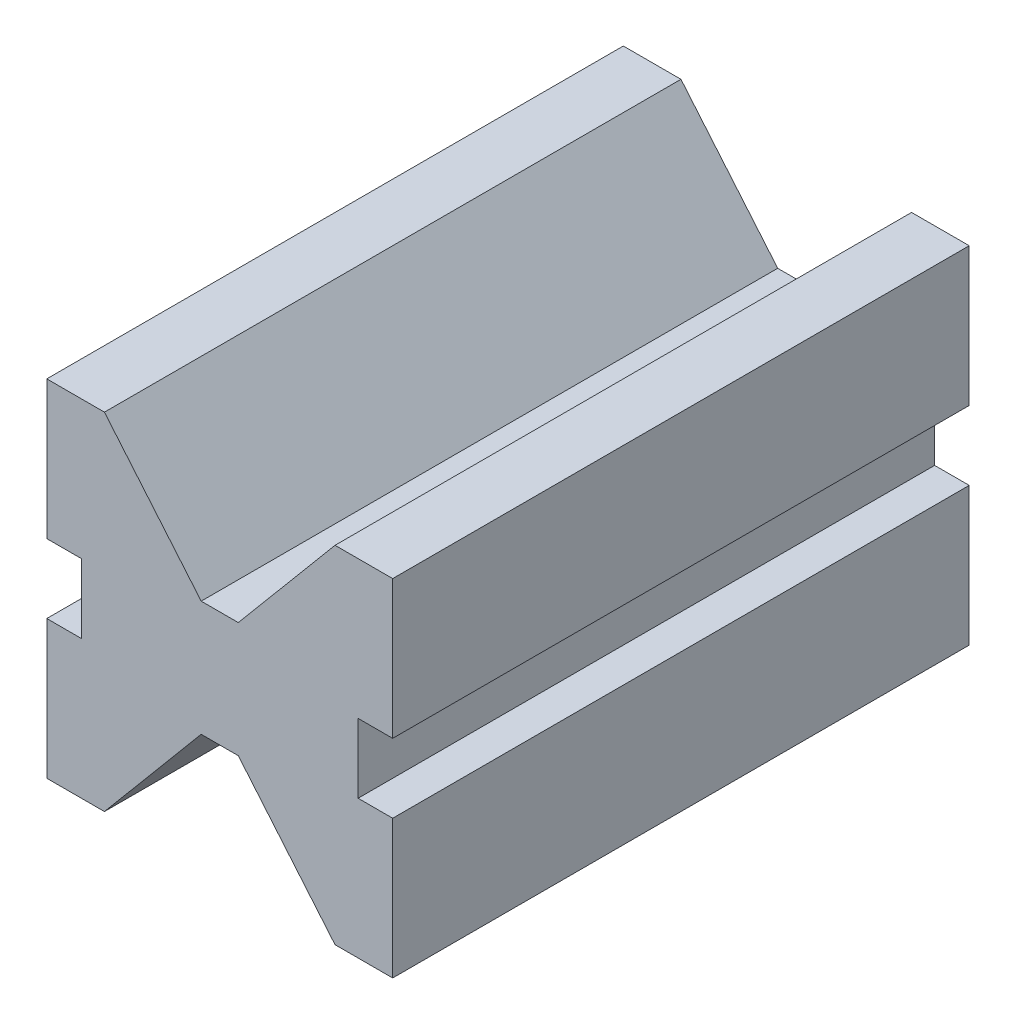
ISO-10303-21;
HEADER;
FILE_DESCRIPTION(('STEP AP214'),'2;1');
FILE_NAME('part.step','',(''),(''),'','','');
FILE_SCHEMA(('AUTOMOTIVE_DESIGN { 1 0 10303 214 1 1 1 1 }'));
ENDSEC;
DATA;
#1=APPLICATION_CONTEXT('core data for automotive mechanical design processes');
#2=APPLICATION_PROTOCOL_DEFINITION('international standard','automotive_design',2000,#1);
#3=PRODUCT_CONTEXT('',#1,'mechanical');
#4=PRODUCT('Part','Part','',(#3));
#5=PRODUCT_RELATED_PRODUCT_CATEGORY('part','',(#4));
#6=PRODUCT_DEFINITION_FORMATION('','',#4);
#7=PRODUCT_DEFINITION_CONTEXT('part definition',#1,'design');
#8=PRODUCT_DEFINITION('design','',#6,#7);
#9=PRODUCT_DEFINITION_SHAPE('','',#8);
#10=(LENGTH_UNIT() NAMED_UNIT(*) SI_UNIT(.MILLI.,.METRE.));
#11=(NAMED_UNIT(*) PLANE_ANGLE_UNIT() SI_UNIT($,.RADIAN.));
#12=(NAMED_UNIT(*) SI_UNIT($,.STERADIAN.) SOLID_ANGLE_UNIT());
#13=UNCERTAINTY_MEASURE_WITH_UNIT(LENGTH_MEASURE(1.E-05),#10,'distance_accuracy_value','');
#14=(GEOMETRIC_REPRESENTATION_CONTEXT(3) GLOBAL_UNCERTAINTY_ASSIGNED_CONTEXT((#13)) GLOBAL_UNIT_ASSIGNED_CONTEXT((#10,
#11,#12)) REPRESENTATION_CONTEXT('',''));
#15=CARTESIAN_POINT('',(0.,0.,0.));
#16=DIRECTION('',(0.,0.,1.));
#17=DIRECTION('',(1.,0.,0.));
#18=AXIS2_PLACEMENT_3D('',#15,#16,#17);
#19=CARTESIAN_POINT('',(-20.,0.,-100.));
#20=DIRECTION('',(0.766044443118979,-0.642787609686538,0.));
#21=DIRECTION('',(0.642787609686538,0.766044443118979,0.));
#22=AXIS2_PLACEMENT_3D('',#19,#20,#21);
#23=PLANE('',#22);
#24=DIRECTION('',(0.642787609686538,0.766044443118979,0.));
#25=VECTOR('',#24,1.);
#26=CARTESIAN_POINT('',(-20.,0.,0.));
#27=LINE('',#26,#25);
#28=CARTESIAN_POINT('',(-20.,0.,0.));
#29=VERTEX_POINT('',#28);
#30=CARTESIAN_POINT('',(-3.21800737645446,20.,0.));
#31=VERTEX_POINT('',#30);
#32=EDGE_CURVE('E220',#29,#31,#27,.T.);
#33=ORIENTED_EDGE('',*,*,#32,.F.);
#34=DIRECTION('',(0.,0.,1.));
#35=VECTOR('',#34,1.);
#36=CARTESIAN_POINT('',(-20.,0.,-100.));
#37=LINE('',#36,#35);
#38=CARTESIAN_POINT('',(-20.,0.,-100.));
#39=VERTEX_POINT('',#38);
#40=EDGE_CURVE('E11',#39,#29,#37,.T.);
#41=ORIENTED_EDGE('',*,*,#40,.F.);
#42=DIRECTION('',(0.642787609686538,0.766044443118979,0.));
#43=VECTOR('',#42,1.);
#44=CARTESIAN_POINT('',(-20.,0.,-100.));
#45=LINE('',#44,#43);
#46=CARTESIAN_POINT('',(-3.21800737645446,20.,-100.));
#47=VERTEX_POINT('',#46);
#48=EDGE_CURVE('E296',#39,#47,#45,.T.);
#49=ORIENTED_EDGE('',*,*,#48,.T.);
#50=DIRECTION('',(0.,0.,1.));
#51=VECTOR('',#50,1.);
#52=CARTESIAN_POINT('',(-3.21800737645446,20.,-100.));
#53=LINE('',#52,#51);
#54=EDGE_CURVE('E48',#47,#31,#53,.T.);
#55=ORIENTED_EDGE('',*,*,#54,.T.);
#56=EDGE_LOOP('',(#33,#41,#49,#55));
#57=FACE_BOUND('',#56,.T.);
#58=ADVANCED_FACE('F45',(#57),#23,.T.);
#59=CARTESIAN_POINT('',(-20.,0.,-100.));
#60=DIRECTION('',(0.,-1.,0.));
#61=DIRECTION('',(1.,0.,0.));
#62=AXIS2_PLACEMENT_3D('',#59,#60,#61);
#63=PLANE('',#62);
#64=DIRECTION('',(1.,0.,0.));
#65=VECTOR('',#64,1.);
#66=CARTESIAN_POINT('',(-20.,0.,0.));
#67=LINE('',#66,#65);
#68=CARTESIAN_POINT('',(-30.,0.,0.));
#69=VERTEX_POINT('',#68);
#70=EDGE_CURVE('E293',#69,#29,#67,.T.);
#71=ORIENTED_EDGE('',*,*,#70,.F.);
#72=DIRECTION('',(0.,0.,1.));
#73=VECTOR('',#72,1.);
#74=CARTESIAN_POINT('',(-30.,0.,-100.));
#75=LINE('',#74,#73);
#76=CARTESIAN_POINT('',(-30.,0.,-100.));
#77=VERTEX_POINT('',#76);
#78=EDGE_CURVE('E55',#77,#69,#75,.T.);
#79=ORIENTED_EDGE('',*,*,#78,.F.);
#80=DIRECTION('',(1.,0.,0.));
#81=VECTOR('',#80,1.);
#82=CARTESIAN_POINT('',(-20.,0.,-100.));
#83=LINE('',#82,#81);
#84=EDGE_CURVE('E206',#77,#39,#83,.T.);
#85=ORIENTED_EDGE('',*,*,#84,.T.);
#86=ORIENTED_EDGE('',*,*,#40,.T.);
#87=EDGE_LOOP('',(#71,#79,#85,#86));
#88=FACE_BOUND('',#87,.T.);
#89=ADVANCED_FACE('F350',(#88),#63,.T.);
#90=CARTESIAN_POINT('',(-30.,0.,-100.));
#91=DIRECTION('',(-1.,0.,0.));
#92=DIRECTION('',(0.,0.,1.));
#93=AXIS2_PLACEMENT_3D('',#90,#91,#92);
#94=PLANE('',#93);
#95=DIRECTION('',(0.,-1.,0.));
#96=VECTOR('',#95,1.);
#97=CARTESIAN_POINT('',(-30.,0.,0.));
#98=LINE('',#97,#96);
#99=CARTESIAN_POINT('',(-30.,24.,0.));
#100=VERTEX_POINT('',#99);
#101=EDGE_CURVE('E192',#100,#69,#98,.T.);
#102=ORIENTED_EDGE('',*,*,#101,.F.);
#103=DIRECTION('',(0.,0.,1.));
#104=VECTOR('',#103,1.);
#105=CARTESIAN_POINT('',(-30.,24.,-100.));
#106=LINE('',#105,#104);
#107=CARTESIAN_POINT('',(-30.,24.,-100.));
#108=VERTEX_POINT('',#107);
#109=EDGE_CURVE('E187',#108,#100,#106,.T.);
#110=ORIENTED_EDGE('',*,*,#109,.F.);
#111=DIRECTION('',(0.,-1.,0.));
#112=VECTOR('',#111,1.);
#113=CARTESIAN_POINT('',(-30.,0.,-100.));
#114=LINE('',#113,#112);
#115=EDGE_CURVE('E190',#108,#77,#114,.T.);
#116=ORIENTED_EDGE('',*,*,#115,.T.);
#117=ORIENTED_EDGE('',*,*,#78,.T.);
#118=EDGE_LOOP('',(#102,#110,#116,#117));
#119=FACE_BOUND('',#118,.T.);
#120=ADVANCED_FACE('F189',(#119),#94,.T.);
#121=CARTESIAN_POINT('',(-30.,24.,-100.));
#122=DIRECTION('',(0.,1.,0.));
#123=DIRECTION('',(0.,0.,1.));
#124=AXIS2_PLACEMENT_3D('',#121,#122,#123);
#125=PLANE('',#124);
#126=DIRECTION('',(-1.,0.,0.));
#127=VECTOR('',#126,1.);
#128=CARTESIAN_POINT('',(-30.,24.,0.));
#129=LINE('',#128,#127);
#130=CARTESIAN_POINT('',(-24.,24.,0.));
#131=VERTEX_POINT('',#130);
#132=EDGE_CURVE('E288',#131,#100,#129,.T.);
#133=ORIENTED_EDGE('',*,*,#132,.F.);
#134=DIRECTION('',(0.,0.,1.));
#135=VECTOR('',#134,1.);
#136=CARTESIAN_POINT('',(-24.,24.,-100.));
#137=LINE('',#136,#135);
#138=CARTESIAN_POINT('',(-24.,24.,-100.));
#139=VERTEX_POINT('',#138);
#140=EDGE_CURVE('E198',#139,#131,#137,.T.);
#141=ORIENTED_EDGE('',*,*,#140,.F.);
#142=DIRECTION('',(-1.,0.,0.));
#143=VECTOR('',#142,1.);
#144=CARTESIAN_POINT('',(-30.,24.,-100.));
#145=LINE('',#144,#143);
#146=EDGE_CURVE('E204',#139,#108,#145,.T.);
#147=ORIENTED_EDGE('',*,*,#146,.T.);
#148=ORIENTED_EDGE('',*,*,#109,.T.);
#149=EDGE_LOOP('',(#133,#141,#147,#148));
#150=FACE_BOUND('',#149,.T.);
#151=ADVANCED_FACE('F209',(#150),#125,.T.);
#152=CARTESIAN_POINT('',(-24.,24.,-100.));
#153=DIRECTION('',(-1.,0.,0.));
#154=DIRECTION('',(0.,0.,1.));
#155=AXIS2_PLACEMENT_3D('',#152,#153,#154);
#156=PLANE('',#155);
#157=DIRECTION('',(0.,-1.,0.));
#158=VECTOR('',#157,1.);
#159=CARTESIAN_POINT('',(-24.,24.,0.));
#160=LINE('',#159,#158);
#161=CARTESIAN_POINT('',(-24.,36.,0.));
#162=VERTEX_POINT('',#161);
#163=EDGE_CURVE('E284',#162,#131,#160,.T.);
#164=ORIENTED_EDGE('',*,*,#163,.F.);
#165=DIRECTION('',(0.,0.,1.));
#166=VECTOR('',#165,1.);
#167=CARTESIAN_POINT('',(-24.,36.,-100.));
#168=LINE('',#167,#166);
#169=CARTESIAN_POINT('',(-24.,36.,-100.));
#170=VERTEX_POINT('',#169);
#171=EDGE_CURVE('E302',#170,#162,#168,.T.);
#172=ORIENTED_EDGE('',*,*,#171,.F.);
#173=DIRECTION('',(0.,-1.,0.));
#174=VECTOR('',#173,1.);
#175=CARTESIAN_POINT('',(-24.,24.,-100.));
#176=LINE('',#175,#174);
#177=EDGE_CURVE('E211',#170,#139,#176,.T.);
#178=ORIENTED_EDGE('',*,*,#177,.T.);
#179=ORIENTED_EDGE('',*,*,#140,.T.);
#180=EDGE_LOOP('',(#164,#172,#178,#179));
#181=FACE_BOUND('',#180,.T.);
#182=ADVANCED_FACE('F363',(#181),#156,.T.);
#183=CARTESIAN_POINT('',(-24.,36.,-100.));
#184=DIRECTION('',(0.,-1.,0.));
#185=DIRECTION('',(1.,0.,0.));
#186=AXIS2_PLACEMENT_3D('',#183,#184,#185);
#187=PLANE('',#186);
#188=DIRECTION('',(1.,0.,0.));
#189=VECTOR('',#188,1.);
#190=CARTESIAN_POINT('',(-24.,36.,0.));
#191=LINE('',#190,#189);
#192=CARTESIAN_POINT('',(-30.,36.,0.));
#193=VERTEX_POINT('',#192);
#194=EDGE_CURVE('E280',#193,#162,#191,.T.);
#195=ORIENTED_EDGE('',*,*,#194,.F.);
#196=DIRECTION('',(0.,0.,1.));
#197=VECTOR('',#196,1.);
#198=CARTESIAN_POINT('',(-30.,36.,-100.));
#199=LINE('',#198,#197);
#200=CARTESIAN_POINT('',(-30.,36.,-100.));
#201=VERTEX_POINT('',#200);
#202=EDGE_CURVE('E305',#201,#193,#199,.T.);
#203=ORIENTED_EDGE('',*,*,#202,.F.);
#204=DIRECTION('',(1.,0.,0.));
#205=VECTOR('',#204,1.);
#206=CARTESIAN_POINT('',(-24.,36.,-100.));
#207=LINE('',#206,#205);
#208=EDGE_CURVE('E214',#201,#170,#207,.T.);
#209=ORIENTED_EDGE('',*,*,#208,.T.);
#210=ORIENTED_EDGE('',*,*,#171,.T.);
#211=EDGE_LOOP('',(#195,#203,#209,#210));
#212=FACE_BOUND('',#211,.T.);
#213=ADVANCED_FACE('F366',(#212),#187,.T.);
#214=CARTESIAN_POINT('',(-30.,36.,-100.));
#215=DIRECTION('',(-1.,0.,0.));
#216=DIRECTION('',(0.,0.,1.));
#217=AXIS2_PLACEMENT_3D('',#214,#215,#216);
#218=PLANE('',#217);
#219=DIRECTION('',(0.,-1.,0.));
#220=VECTOR('',#219,1.);
#221=CARTESIAN_POINT('',(-30.,36.,0.));
#222=LINE('',#221,#220);
#223=CARTESIAN_POINT('',(-30.,60.,0.));
#224=VERTEX_POINT('',#223);
#225=EDGE_CURVE('E276',#224,#193,#222,.T.);
#226=ORIENTED_EDGE('',*,*,#225,.F.);
#227=DIRECTION('',(0.,0.,1.));
#228=VECTOR('',#227,1.);
#229=CARTESIAN_POINT('',(-30.,60.,-100.));
#230=LINE('',#229,#228);
#231=CARTESIAN_POINT('',(-30.,60.,-100.));
#232=VERTEX_POINT('',#231);
#233=EDGE_CURVE('E308',#232,#224,#230,.T.);
#234=ORIENTED_EDGE('',*,*,#233,.F.);
#235=DIRECTION('',(0.,-1.,0.));
#236=VECTOR('',#235,1.);
#237=CARTESIAN_POINT('',(-30.,36.,-100.));
#238=LINE('',#237,#236);
#239=EDGE_CURVE('E605',#232,#201,#238,.T.);
#240=ORIENTED_EDGE('',*,*,#239,.T.);
#241=ORIENTED_EDGE('',*,*,#202,.T.);
#242=EDGE_LOOP('',(#226,#234,#240,#241));
#243=FACE_BOUND('',#242,.T.);
#244=ADVANCED_FACE('F370',(#243),#218,.T.);
#245=CARTESIAN_POINT('',(-30.,60.,-100.));
#246=DIRECTION('',(0.,1.,0.));
#247=DIRECTION('',(0.,0.,1.));
#248=AXIS2_PLACEMENT_3D('',#245,#246,#247);
#249=PLANE('',#248);
#250=DIRECTION('',(-1.,0.,0.));
#251=VECTOR('',#250,1.);
#252=CARTESIAN_POINT('',(-30.,60.,0.));
#253=LINE('',#252,#251);
#254=CARTESIAN_POINT('',(-20.,60.,0.));
#255=VERTEX_POINT('',#254);
#256=EDGE_CURVE('E272',#255,#224,#253,.T.);
#257=ORIENTED_EDGE('',*,*,#256,.F.);
#258=DIRECTION('',(0.,0.,1.));
#259=VECTOR('',#258,1.);
#260=CARTESIAN_POINT('',(-20.,60.,-100.));
#261=LINE('',#260,#259);
#262=CARTESIAN_POINT('',(-20.,60.,-100.));
#263=VERTEX_POINT('',#262);
#264=EDGE_CURVE('E311',#263,#255,#261,.T.);
#265=ORIENTED_EDGE('',*,*,#264,.F.);
#266=DIRECTION('',(-1.,0.,0.));
#267=VECTOR('',#266,1.);
#268=CARTESIAN_POINT('',(-30.,60.,-100.));
#269=LINE('',#268,#267);
#270=EDGE_CURVE('E598',#263,#232,#269,.T.);
#271=ORIENTED_EDGE('',*,*,#270,.T.);
#272=ORIENTED_EDGE('',*,*,#233,.T.);
#273=EDGE_LOOP('',(#257,#265,#271,#272));
#274=FACE_BOUND('',#273,.T.);
#275=ADVANCED_FACE('F374',(#274),#249,.T.);
#276=CARTESIAN_POINT('',(-20.,60.,-100.));
#277=DIRECTION('',(0.766044443118979,0.642787609686538,0.));
#278=DIRECTION('',(-0.642787609686538,0.766044443118979,0.));
#279=AXIS2_PLACEMENT_3D('',#276,#277,#278);
#280=PLANE('',#279);
#281=DIRECTION('',(-0.642787609686538,0.766044443118979,0.));
#282=VECTOR('',#281,1.);
#283=CARTESIAN_POINT('',(-20.,60.,0.));
#284=LINE('',#283,#282);
#285=CARTESIAN_POINT('',(-3.21800737645446,40.,0.));
#286=VERTEX_POINT('',#285);
#287=EDGE_CURVE('E268',#286,#255,#284,.T.);
#288=ORIENTED_EDGE('',*,*,#287,.F.);
#289=DIRECTION('',(0.,0.,1.));
#290=VECTOR('',#289,1.);
#291=CARTESIAN_POINT('',(-3.21800737645446,40.,-100.));
#292=LINE('',#291,#290);
#293=CARTESIAN_POINT('',(-3.21800737645446,40.,-100.));
#294=VERTEX_POINT('',#293);
#295=EDGE_CURVE('E314',#294,#286,#292,.T.);
#296=ORIENTED_EDGE('',*,*,#295,.F.);
#297=DIRECTION('',(-0.642787609686538,0.766044443118979,0.));
#298=VECTOR('',#297,1.);
#299=CARTESIAN_POINT('',(-20.,60.,-100.));
#300=LINE('',#299,#298);
#301=EDGE_CURVE('E594',#294,#263,#300,.T.);
#302=ORIENTED_EDGE('',*,*,#301,.T.);
#303=ORIENTED_EDGE('',*,*,#264,.T.);
#304=EDGE_LOOP('',(#288,#296,#302,#303));
#305=FACE_BOUND('',#304,.T.);
#306=ADVANCED_FACE('F378',(#305),#280,.T.);
#307=CARTESIAN_POINT('',(-3.21800737645446,40.,-100.));
#308=DIRECTION('',(0.,1.,0.));
#309=DIRECTION('',(0.,0.,1.));
#310=AXIS2_PLACEMENT_3D('',#307,#308,#309);
#311=PLANE('',#310);
#312=DIRECTION('',(-1.,0.,0.));
#313=VECTOR('',#312,1.);
#314=CARTESIAN_POINT('',(-3.21800737645446,40.,0.));
#315=LINE('',#314,#313);
#316=CARTESIAN_POINT('',(3.21800737645446,40.,0.));
#317=VERTEX_POINT('',#316);
#318=EDGE_CURVE('E264',#317,#286,#315,.T.);
#319=ORIENTED_EDGE('',*,*,#318,.F.);
#320=DIRECTION('',(0.,0.,1.));
#321=VECTOR('',#320,1.);
#322=CARTESIAN_POINT('',(3.21800737645446,40.,-100.));
#323=LINE('',#322,#321);
#324=CARTESIAN_POINT('',(3.21800737645446,40.,-100.));
#325=VERTEX_POINT('',#324);
#326=EDGE_CURVE('E317',#325,#317,#323,.T.);
#327=ORIENTED_EDGE('',*,*,#326,.F.);
#328=DIRECTION('',(-1.,0.,0.));
#329=VECTOR('',#328,1.);
#330=CARTESIAN_POINT('',(-3.21800737645446,40.,-100.));
#331=LINE('',#330,#329);
#332=EDGE_CURVE('E614',#325,#294,#331,.T.);
#333=ORIENTED_EDGE('',*,*,#332,.T.);
#334=ORIENTED_EDGE('',*,*,#295,.T.);
#335=EDGE_LOOP('',(#319,#327,#333,#334));
#336=FACE_BOUND('',#335,.T.);
#337=ADVANCED_FACE('F382',(#336),#311,.T.);
#338=CARTESIAN_POINT('',(20.,60.,-100.));
#339=DIRECTION('',(-0.766044443118979,0.642787609686538,0.));
#340=DIRECTION('',(-0.642787609686538,-0.766044443118979,0.));
#341=AXIS2_PLACEMENT_3D('',#338,#339,#340);
#342=PLANE('',#341);
#343=DIRECTION('',(-0.642787609686538,-0.766044443118979,0.));
#344=VECTOR('',#343,1.);
#345=CARTESIAN_POINT('',(20.,60.,0.));
#346=LINE('',#345,#344);
#347=CARTESIAN_POINT('',(20.,60.,0.));
#348=VERTEX_POINT('',#347);
#349=EDGE_CURVE('E260',#348,#317,#346,.T.);
#350=ORIENTED_EDGE('',*,*,#349,.F.);
#351=DIRECTION('',(0.,0.,1.));
#352=VECTOR('',#351,1.);
#353=CARTESIAN_POINT('',(20.,60.,-100.));
#354=LINE('',#353,#352);
#355=CARTESIAN_POINT('',(20.,60.,-100.));
#356=VERTEX_POINT('',#355);
#357=EDGE_CURVE('E320',#356,#348,#354,.T.);
#358=ORIENTED_EDGE('',*,*,#357,.F.);
#359=DIRECTION('',(-0.642787609686538,-0.766044443118979,0.));
#360=VECTOR('',#359,1.);
#361=CARTESIAN_POINT('',(20.,60.,-100.));
#362=LINE('',#361,#360);
#363=EDGE_CURVE('E587',#356,#325,#362,.T.);
#364=ORIENTED_EDGE('',*,*,#363,.T.);
#365=ORIENTED_EDGE('',*,*,#326,.T.);
#366=EDGE_LOOP('',(#350,#358,#364,#365));
#367=FACE_BOUND('',#366,.T.);
#368=ADVANCED_FACE('F386',(#367),#342,.T.);
#369=CARTESIAN_POINT('',(30.,60.,-100.));
#370=DIRECTION('',(0.,1.,0.));
#371=DIRECTION('',(0.,0.,1.));
#372=AXIS2_PLACEMENT_3D('',#369,#370,#371);
#373=PLANE('',#372);
#374=DIRECTION('',(-1.,0.,0.));
#375=VECTOR('',#374,1.);
#376=CARTESIAN_POINT('',(30.,60.,0.));
#377=LINE('',#376,#375);
#378=CARTESIAN_POINT('',(30.,60.,0.));
#379=VERTEX_POINT('',#378);
#380=EDGE_CURVE('E256',#379,#348,#377,.T.);
#381=ORIENTED_EDGE('',*,*,#380,.F.);
#382=DIRECTION('',(0.,0.,1.));
#383=VECTOR('',#382,1.);
#384=CARTESIAN_POINT('',(30.,60.,-100.));
#385=LINE('',#384,#383);
#386=CARTESIAN_POINT('',(30.,60.,-100.));
#387=VERTEX_POINT('',#386);
#388=EDGE_CURVE('E323',#387,#379,#385,.T.);
#389=ORIENTED_EDGE('',*,*,#388,.F.);
#390=DIRECTION('',(-1.,0.,0.));
#391=VECTOR('',#390,1.);
#392=CARTESIAN_POINT('',(30.,60.,-100.));
#393=LINE('',#392,#391);
#394=EDGE_CURVE('E583',#387,#356,#393,.T.);
#395=ORIENTED_EDGE('',*,*,#394,.T.);
#396=ORIENTED_EDGE('',*,*,#357,.T.);
#397=EDGE_LOOP('',(#381,#389,#395,#396));
#398=FACE_BOUND('',#397,.T.);
#399=ADVANCED_FACE('F390',(#398),#373,.T.);
#400=CARTESIAN_POINT('',(30.,36.,-100.));
#401=DIRECTION('',(1.,0.,0.));
#402=DIRECTION('',(0.,0.,-1.));
#403=AXIS2_PLACEMENT_3D('',#400,#401,#402);
#404=PLANE('',#403);
#405=DIRECTION('',(0.,1.,0.));
#406=VECTOR('',#405,1.);
#407=CARTESIAN_POINT('',(30.,36.,0.));
#408=LINE('',#407,#406);
#409=CARTESIAN_POINT('',(30.,36.,0.));
#410=VERTEX_POINT('',#409);
#411=EDGE_CURVE('E252',#410,#379,#408,.T.);
#412=ORIENTED_EDGE('',*,*,#411,.F.);
#413=DIRECTION('',(0.,0.,1.));
#414=VECTOR('',#413,1.);
#415=CARTESIAN_POINT('',(30.,36.,-100.));
#416=LINE('',#415,#414);
#417=CARTESIAN_POINT('',(30.,36.,-100.));
#418=VERTEX_POINT('',#417);
#419=EDGE_CURVE('E326',#418,#410,#416,.T.);
#420=ORIENTED_EDGE('',*,*,#419,.F.);
#421=DIRECTION('',(0.,1.,0.));
#422=VECTOR('',#421,1.);
#423=CARTESIAN_POINT('',(30.,36.,-100.));
#424=LINE('',#423,#422);
#425=EDGE_CURVE('E621',#418,#387,#424,.T.);
#426=ORIENTED_EDGE('',*,*,#425,.T.);
#427=ORIENTED_EDGE('',*,*,#388,.T.);
#428=EDGE_LOOP('',(#412,#420,#426,#427));
#429=FACE_BOUND('',#428,.T.);
#430=ADVANCED_FACE('F394',(#429),#404,.T.);
#431=CARTESIAN_POINT('',(24.,36.,-100.));
#432=DIRECTION('',(0.,-1.,0.));
#433=DIRECTION('',(1.,0.,0.));
#434=AXIS2_PLACEMENT_3D('',#431,#432,#433);
#435=PLANE('',#434);
#436=DIRECTION('',(1.,0.,0.));
#437=VECTOR('',#436,1.);
#438=CARTESIAN_POINT('',(24.,36.,0.));
#439=LINE('',#438,#437);
#440=CARTESIAN_POINT('',(24.,36.,0.));
#441=VERTEX_POINT('',#440);
#442=EDGE_CURVE('E248',#441,#410,#439,.T.);
#443=ORIENTED_EDGE('',*,*,#442,.F.);
#444=DIRECTION('',(0.,0.,1.));
#445=VECTOR('',#444,1.);
#446=CARTESIAN_POINT('',(24.,36.,-100.));
#447=LINE('',#446,#445);
#448=CARTESIAN_POINT('',(24.,36.,-100.));
#449=VERTEX_POINT('',#448);
#450=EDGE_CURVE('E329',#449,#441,#447,.T.);
#451=ORIENTED_EDGE('',*,*,#450,.F.);
#452=DIRECTION('',(1.,0.,0.));
#453=VECTOR('',#452,1.);
#454=CARTESIAN_POINT('',(24.,36.,-100.));
#455=LINE('',#454,#453);
#456=EDGE_CURVE('E576',#449,#418,#455,.T.);
#457=ORIENTED_EDGE('',*,*,#456,.T.);
#458=ORIENTED_EDGE('',*,*,#419,.T.);
#459=EDGE_LOOP('',(#443,#451,#457,#458));
#460=FACE_BOUND('',#459,.T.);
#461=ADVANCED_FACE('F398',(#460),#435,.T.);
#462=CARTESIAN_POINT('',(24.,24.,-100.));
#463=DIRECTION('',(1.,0.,0.));
#464=DIRECTION('',(0.,0.,-1.));
#465=AXIS2_PLACEMENT_3D('',#462,#463,#464);
#466=PLANE('',#465);
#467=DIRECTION('',(0.,1.,0.));
#468=VECTOR('',#467,1.);
#469=CARTESIAN_POINT('',(24.,24.,0.));
#470=LINE('',#469,#468);
#471=CARTESIAN_POINT('',(24.,24.,0.));
#472=VERTEX_POINT('',#471);
#473=EDGE_CURVE('E244',#472,#441,#470,.T.);
#474=ORIENTED_EDGE('',*,*,#473,.F.);
#475=DIRECTION('',(0.,0.,1.));
#476=VECTOR('',#475,1.);
#477=CARTESIAN_POINT('',(24.,24.,-100.));
#478=LINE('',#477,#476);
#479=CARTESIAN_POINT('',(24.,24.,-100.));
#480=VERTEX_POINT('',#479);
#481=EDGE_CURVE('E332',#480,#472,#478,.T.);
#482=ORIENTED_EDGE('',*,*,#481,.F.);
#483=DIRECTION('',(0.,1.,0.));
#484=VECTOR('',#483,1.);
#485=CARTESIAN_POINT('',(24.,24.,-100.));
#486=LINE('',#485,#484);
#487=EDGE_CURVE('E572',#480,#449,#486,.T.);
#488=ORIENTED_EDGE('',*,*,#487,.T.);
#489=ORIENTED_EDGE('',*,*,#450,.T.);
#490=EDGE_LOOP('',(#474,#482,#488,#489));
#491=FACE_BOUND('',#490,.T.);
#492=ADVANCED_FACE('F402',(#491),#466,.T.);
#493=CARTESIAN_POINT('',(30.,24.,-100.));
#494=DIRECTION('',(0.,1.,0.));
#495=DIRECTION('',(0.,0.,1.));
#496=AXIS2_PLACEMENT_3D('',#493,#494,#495);
#497=PLANE('',#496);
#498=DIRECTION('',(-1.,0.,0.));
#499=VECTOR('',#498,1.);
#500=CARTESIAN_POINT('',(30.,24.,0.));
#501=LINE('',#500,#499);
#502=CARTESIAN_POINT('',(30.,24.,0.));
#503=VERTEX_POINT('',#502);
#504=EDGE_CURVE('E240',#503,#472,#501,.T.);
#505=ORIENTED_EDGE('',*,*,#504,.F.);
#506=DIRECTION('',(0.,0.,1.));
#507=VECTOR('',#506,1.);
#508=CARTESIAN_POINT('',(30.,24.,-100.));
#509=LINE('',#508,#507);
#510=CARTESIAN_POINT('',(30.,24.,-100.));
#511=VERTEX_POINT('',#510);
#512=EDGE_CURVE('E335',#511,#503,#509,.T.);
#513=ORIENTED_EDGE('',*,*,#512,.F.);
#514=DIRECTION('',(-1.,0.,0.));
#515=VECTOR('',#514,1.);
#516=CARTESIAN_POINT('',(30.,24.,-100.));
#517=LINE('',#516,#515);
#518=EDGE_CURVE('E628',#511,#480,#517,.T.);
#519=ORIENTED_EDGE('',*,*,#518,.T.);
#520=ORIENTED_EDGE('',*,*,#481,.T.);
#521=EDGE_LOOP('',(#505,#513,#519,#520));
#522=FACE_BOUND('',#521,.T.);
#523=ADVANCED_FACE('F406',(#522),#497,.T.);
#524=CARTESIAN_POINT('',(30.,0.,-100.));
#525=DIRECTION('',(1.,0.,0.));
#526=DIRECTION('',(0.,0.,-1.));
#527=AXIS2_PLACEMENT_3D('',#524,#525,#526);
#528=PLANE('',#527);
#529=DIRECTION('',(0.,1.,0.));
#530=VECTOR('',#529,1.);
#531=CARTESIAN_POINT('',(30.,0.,0.));
#532=LINE('',#531,#530);
#533=CARTESIAN_POINT('',(30.,0.,0.));
#534=VERTEX_POINT('',#533);
#535=EDGE_CURVE('E236',#534,#503,#532,.T.);
#536=ORIENTED_EDGE('',*,*,#535,.F.);
#537=DIRECTION('',(0.,0.,1.));
#538=VECTOR('',#537,1.);
#539=CARTESIAN_POINT('',(30.,0.,-100.));
#540=LINE('',#539,#538);
#541=CARTESIAN_POINT('',(30.,0.,-100.));
#542=VERTEX_POINT('',#541);
#543=EDGE_CURVE('E338',#542,#534,#540,.T.);
#544=ORIENTED_EDGE('',*,*,#543,.F.);
#545=DIRECTION('',(0.,1.,0.));
#546=VECTOR('',#545,1.);
#547=CARTESIAN_POINT('',(30.,0.,-100.));
#548=LINE('',#547,#546);
#549=EDGE_CURVE('E565',#542,#511,#548,.T.);
#550=ORIENTED_EDGE('',*,*,#549,.T.);
#551=ORIENTED_EDGE('',*,*,#512,.T.);
#552=EDGE_LOOP('',(#536,#544,#550,#551));
#553=FACE_BOUND('',#552,.T.);
#554=ADVANCED_FACE('F410',(#553),#528,.T.);
#555=CARTESIAN_POINT('',(20.,0.,-100.));
#556=DIRECTION('',(0.,-1.,0.));
#557=DIRECTION('',(1.,0.,0.));
#558=AXIS2_PLACEMENT_3D('',#555,#556,#557);
#559=PLANE('',#558);
#560=DIRECTION('',(1.,0.,0.));
#561=VECTOR('',#560,1.);
#562=CARTESIAN_POINT('',(20.,0.,0.));
#563=LINE('',#562,#561);
#564=CARTESIAN_POINT('',(20.,0.,0.));
#565=VERTEX_POINT('',#564);
#566=EDGE_CURVE('E232',#565,#534,#563,.T.);
#567=ORIENTED_EDGE('',*,*,#566,.F.);
#568=DIRECTION('',(0.,0.,1.));
#569=VECTOR('',#568,1.);
#570=CARTESIAN_POINT('',(20.,0.,-100.));
#571=LINE('',#570,#569);
#572=CARTESIAN_POINT('',(20.,0.,-100.));
#573=VERTEX_POINT('',#572);
#574=EDGE_CURVE('E341',#573,#565,#571,.T.);
#575=ORIENTED_EDGE('',*,*,#574,.F.);
#576=DIRECTION('',(1.,0.,0.));
#577=VECTOR('',#576,1.);
#578=CARTESIAN_POINT('',(20.,0.,-100.));
#579=LINE('',#578,#577);
#580=EDGE_CURVE('E561',#573,#542,#579,.T.);
#581=ORIENTED_EDGE('',*,*,#580,.T.);
#582=ORIENTED_EDGE('',*,*,#543,.T.);
#583=EDGE_LOOP('',(#567,#575,#581,#582));
#584=FACE_BOUND('',#583,.T.);
#585=ADVANCED_FACE('F414',(#584),#559,.T.);
#586=CARTESIAN_POINT('',(20.,0.,-100.));
#587=DIRECTION('',(-0.766044443118979,-0.642787609686538,0.));
#588=DIRECTION('',(0.642787609686538,-0.766044443118979,0.));
#589=AXIS2_PLACEMENT_3D('',#586,#587,#588);
#590=PLANE('',#589);
#591=DIRECTION('',(0.642787609686538,-0.766044443118979,0.));
#592=VECTOR('',#591,1.);
#593=CARTESIAN_POINT('',(20.,0.,0.));
#594=LINE('',#593,#592);
#595=CARTESIAN_POINT('',(3.21800737645446,20.,0.));
#596=VERTEX_POINT('',#595);
#597=EDGE_CURVE('E228',#596,#565,#594,.T.);
#598=ORIENTED_EDGE('',*,*,#597,.F.);
#599=DIRECTION('',(0.,0.,1.));
#600=VECTOR('',#599,1.);
#601=CARTESIAN_POINT('',(3.21800737645446,20.,-100.));
#602=LINE('',#601,#600);
#603=CARTESIAN_POINT('',(3.21800737645446,20.,-100.));
#604=VERTEX_POINT('',#603);
#605=EDGE_CURVE('E343',#604,#596,#602,.T.);
#606=ORIENTED_EDGE('',*,*,#605,.F.);
#607=DIRECTION('',(0.642787609686538,-0.766044443118979,0.));
#608=VECTOR('',#607,1.);
#609=CARTESIAN_POINT('',(20.,0.,-100.));
#610=LINE('',#609,#608);
#611=EDGE_CURVE('E635',#604,#573,#610,.T.);
#612=ORIENTED_EDGE('',*,*,#611,.T.);
#613=ORIENTED_EDGE('',*,*,#574,.T.);
#614=EDGE_LOOP('',(#598,#606,#612,#613));
#615=FACE_BOUND('',#614,.T.);
#616=ADVANCED_FACE('F418',(#615),#590,.T.);
#617=CARTESIAN_POINT('',(-3.21800737645446,20.,-100.));
#618=DIRECTION('',(0.,-1.,0.));
#619=DIRECTION('',(0.,0.,-1.));
#620=AXIS2_PLACEMENT_3D('',#617,#618,#619);
#621=PLANE('',#620);
#622=DIRECTION('',(1.,0.,0.));
#623=VECTOR('',#622,1.);
#624=CARTESIAN_POINT('',(-3.21800737645446,20.,0.));
#625=LINE('',#624,#623);
#626=EDGE_CURVE('E224',#31,#596,#625,.T.);
#627=ORIENTED_EDGE('',*,*,#626,.F.);
#628=ORIENTED_EDGE('',*,*,#54,.F.);
#629=DIRECTION('',(1.,0.,0.));
#630=VECTOR('',#629,1.);
#631=CARTESIAN_POINT('',(-3.21800737645446,20.,-100.));
#632=LINE('',#631,#630);
#633=EDGE_CURVE('E638',#47,#604,#632,.T.);
#634=ORIENTED_EDGE('',*,*,#633,.T.);
#635=ORIENTED_EDGE('',*,*,#605,.T.);
#636=EDGE_LOOP('',(#627,#628,#634,#635));
#637=FACE_BOUND('',#636,.T.);
#638=ADVANCED_FACE('F347',(#637),#621,.T.);
#639=CARTESIAN_POINT('',(0.,0.,-100.));
#640=DIRECTION('',(0.,0.,1.));
#641=DIRECTION('',(1.,0.,0.));
#642=AXIS2_PLACEMENT_3D('',#639,#640,#641);
#643=PLANE('',#642);
#644=ORIENTED_EDGE('',*,*,#48,.F.);
#645=ORIENTED_EDGE('',*,*,#84,.F.);
#646=ORIENTED_EDGE('',*,*,#115,.F.);
#647=ORIENTED_EDGE('',*,*,#146,.F.);
#648=ORIENTED_EDGE('',*,*,#177,.F.);
#649=ORIENTED_EDGE('',*,*,#208,.F.);
#650=ORIENTED_EDGE('',*,*,#239,.F.);
#651=ORIENTED_EDGE('',*,*,#270,.F.);
#652=ORIENTED_EDGE('',*,*,#301,.F.);
#653=ORIENTED_EDGE('',*,*,#332,.F.);
#654=ORIENTED_EDGE('',*,*,#363,.F.);
#655=ORIENTED_EDGE('',*,*,#394,.F.);
#656=ORIENTED_EDGE('',*,*,#425,.F.);
#657=ORIENTED_EDGE('',*,*,#456,.F.);
#658=ORIENTED_EDGE('',*,*,#487,.F.);
#659=ORIENTED_EDGE('',*,*,#518,.F.);
#660=ORIENTED_EDGE('',*,*,#549,.F.);
#661=ORIENTED_EDGE('',*,*,#580,.F.);
#662=ORIENTED_EDGE('',*,*,#611,.F.);
#663=ORIENTED_EDGE('',*,*,#633,.F.);
#664=EDGE_LOOP('',(#644,#645,#646,#647,#648,#649,#650,#651,#652,#653,#654,#655,#656,#657,#658,
#659,#660,#661,#662,#663));
#665=FACE_BOUND('',#664,.T.);
#666=ADVANCED_FACE('F202',(#665),#643,.F.);
#667=CARTESIAN_POINT('',(0.,0.,0.));
#668=DIRECTION('',(0.,0.,1.));
#669=DIRECTION('',(1.,0.,0.));
#670=AXIS2_PLACEMENT_3D('',#667,#668,#669);
#671=PLANE('',#670);
#672=ORIENTED_EDGE('',*,*,#32,.T.);
#673=ORIENTED_EDGE('',*,*,#626,.T.);
#674=ORIENTED_EDGE('',*,*,#597,.T.);
#675=ORIENTED_EDGE('',*,*,#566,.T.);
#676=ORIENTED_EDGE('',*,*,#535,.T.);
#677=ORIENTED_EDGE('',*,*,#504,.T.);
#678=ORIENTED_EDGE('',*,*,#473,.T.);
#679=ORIENTED_EDGE('',*,*,#442,.T.);
#680=ORIENTED_EDGE('',*,*,#411,.T.);
#681=ORIENTED_EDGE('',*,*,#380,.T.);
#682=ORIENTED_EDGE('',*,*,#349,.T.);
#683=ORIENTED_EDGE('',*,*,#318,.T.);
#684=ORIENTED_EDGE('',*,*,#287,.T.);
#685=ORIENTED_EDGE('',*,*,#256,.T.);
#686=ORIENTED_EDGE('',*,*,#225,.T.);
#687=ORIENTED_EDGE('',*,*,#194,.T.);
#688=ORIENTED_EDGE('',*,*,#163,.T.);
#689=ORIENTED_EDGE('',*,*,#132,.T.);
#690=ORIENTED_EDGE('',*,*,#101,.T.);
#691=ORIENTED_EDGE('',*,*,#70,.T.);
#692=EDGE_LOOP('',(#672,#673,#674,#675,#676,#677,#678,#679,#680,#681,#682,#683,#684,#685,#686,
#687,#688,#689,#690,#691));
#693=FACE_BOUND('',#692,.T.);
#694=ADVANCED_FACE('F349',(#693),#671,.T.);
#695=CLOSED_SHELL('',(#58,#89,#120,#151,#182,#213,#244,#275,#306,#337,#368,#399,#430,#461,#492,
#523,#554,#585,#616,#638,#666,#694));
#696=MANIFOLD_SOLID_BREP('B2',#695);
#697=ADVANCED_BREP_SHAPE_REPRESENTATION('',(#18,#696),#14);
#698=SHAPE_DEFINITION_REPRESENTATION(#9,#697);
ENDSEC;
END-ISO-10303-21;
